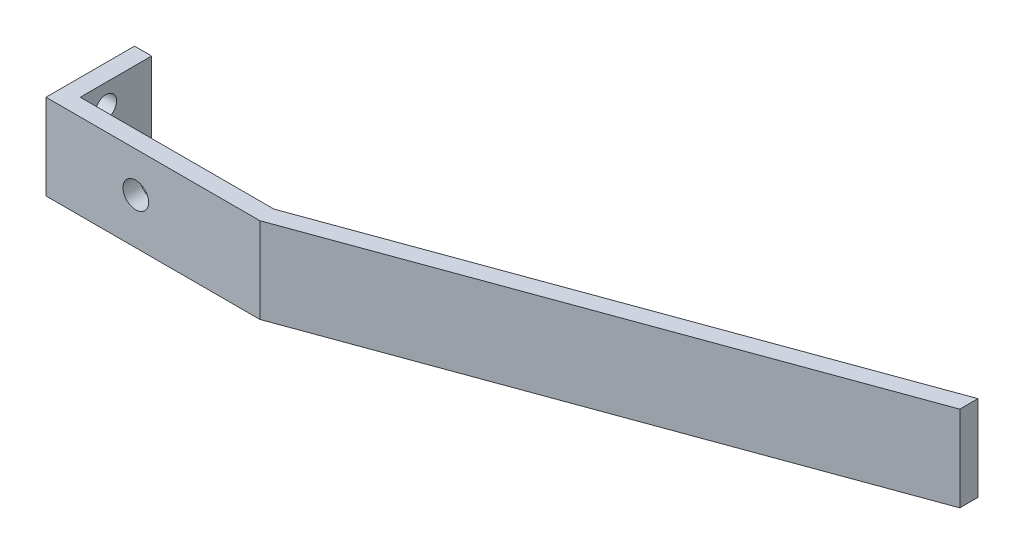
ISO-10303-21;
HEADER;
FILE_DESCRIPTION(('STEP AP214'),'2;1');
FILE_NAME('part.step','',(''),(''),'','','');
FILE_SCHEMA(('AUTOMOTIVE_DESIGN { 1 0 10303 214 1 1 1 1 }'));
ENDSEC;
DATA;
#1=APPLICATION_CONTEXT('core data for automotive mechanical design processes');
#2=APPLICATION_PROTOCOL_DEFINITION('international standard','automotive_design',2000,#1);
#3=PRODUCT_CONTEXT('',#1,'mechanical');
#4=PRODUCT('Part','Part','',(#3));
#5=PRODUCT_RELATED_PRODUCT_CATEGORY('part','',(#4));
#6=PRODUCT_DEFINITION_FORMATION('','',#4);
#7=PRODUCT_DEFINITION_CONTEXT('part definition',#1,'design');
#8=PRODUCT_DEFINITION('design','',#6,#7);
#9=PRODUCT_DEFINITION_SHAPE('','',#8);
#10=(LENGTH_UNIT() NAMED_UNIT(*) SI_UNIT(.MILLI.,.METRE.));
#11=(NAMED_UNIT(*) PLANE_ANGLE_UNIT() SI_UNIT($,.RADIAN.));
#12=(NAMED_UNIT(*) SI_UNIT($,.STERADIAN.) SOLID_ANGLE_UNIT());
#13=UNCERTAINTY_MEASURE_WITH_UNIT(LENGTH_MEASURE(1.E-05),#10,'distance_accuracy_value','');
#14=(GEOMETRIC_REPRESENTATION_CONTEXT(3) GLOBAL_UNCERTAINTY_ASSIGNED_CONTEXT((#13)) GLOBAL_UNIT_ASSIGNED_CONTEXT((#10,
#11,#12)) REPRESENTATION_CONTEXT('',''));
#15=CARTESIAN_POINT('',(0.,0.,0.));
#16=DIRECTION('',(0.,0.,1.));
#17=DIRECTION('',(1.,0.,0.));
#18=AXIS2_PLACEMENT_3D('',#15,#16,#17);
#19=CARTESIAN_POINT('',(0.,20.,0.));
#20=DIRECTION('',(0.,0.,-1.));
#21=DIRECTION('',(-1.,0.,0.));
#22=AXIS2_PLACEMENT_3D('',#19,#20,#21);
#23=PLANE('',#22);
#24=CARTESIAN_POINT('',(21.,10.6900904766501,0.));
#25=DIRECTION('',(0.,0.,1.));
#26=DIRECTION('',(1.,0.,0.));
#27=AXIS2_PLACEMENT_3D('',#24,#25,#26);
#28=CIRCLE('',#27,3.);
#29=CARTESIAN_POINT('',(24.,10.6900904766501,0.));
#30=VERTEX_POINT('',#29);
#31=EDGE_CURVE('E194',#30,#30,#28,.T.);
#32=ORIENTED_EDGE('',*,*,#31,.F.);
#33=EDGE_LOOP('',(#32));
#34=FACE_BOUND('',#33,.T.);
#35=DIRECTION('',(1.,0.,0.));
#36=VECTOR('',#35,1.);
#37=CARTESIAN_POINT('',(0.,0.,0.));
#38=LINE('',#37,#36);
#39=CARTESIAN_POINT('',(0.,0.,0.));
#40=VERTEX_POINT('',#39);
#41=CARTESIAN_POINT('',(50.,0.,0.));
#42=VERTEX_POINT('',#41);
#43=EDGE_CURVE('E135',#40,#42,#38,.T.);
#44=ORIENTED_EDGE('',*,*,#43,.T.);
#45=DIRECTION('',(0.,-1.,0.));
#46=VECTOR('',#45,1.);
#47=CARTESIAN_POINT('',(50.,20.,0.));
#48=LINE('',#47,#46);
#49=CARTESIAN_POINT('',(50.,20.,0.));
#50=VERTEX_POINT('',#49);
#51=EDGE_CURVE('E43',#50,#42,#48,.T.);
#52=ORIENTED_EDGE('',*,*,#51,.F.);
#53=DIRECTION('',(1.,0.,0.));
#54=VECTOR('',#53,1.);
#55=CARTESIAN_POINT('',(0.,20.,0.));
#56=LINE('',#55,#54);
#57=CARTESIAN_POINT('',(0.,20.,0.));
#58=VERTEX_POINT('',#57);
#59=EDGE_CURVE('E95',#58,#50,#56,.T.);
#60=ORIENTED_EDGE('',*,*,#59,.F.);
#61=DIRECTION('',(0.,-1.,0.));
#62=VECTOR('',#61,1.);
#63=CARTESIAN_POINT('',(0.,20.,0.));
#64=LINE('',#63,#62);
#65=EDGE_CURVE('E11',#58,#40,#64,.T.);
#66=ORIENTED_EDGE('',*,*,#65,.T.);
#67=EDGE_LOOP('',(#44,#52,#60,#66));
#68=FACE_BOUND('',#67,.T.);
#69=ADVANCED_FACE('F35',(#34,#68),#23,.F.);
#70=CARTESIAN_POINT('',(50.,20.,0.));
#71=DIRECTION('',(-0.342020143325669,0.,-0.939692620785908));
#72=DIRECTION('',(-0.939692620785908,0.,0.342020143325669));
#73=AXIS2_PLACEMENT_3D('',#70,#71,#72);
#74=PLANE('',#73);
#75=DIRECTION('',(0.939692620785908,0.,-0.342020143325669));
#76=VECTOR('',#75,1.);
#77=CARTESIAN_POINT('',(50.,0.,0.));
#78=LINE('',#77,#76);
#79=CARTESIAN_POINT('',(170.,0.,-43.6764281119444));
#80=VERTEX_POINT('',#79);
#81=EDGE_CURVE('E137',#42,#80,#78,.T.);
#82=ORIENTED_EDGE('',*,*,#81,.T.);
#83=DIRECTION('',(0.,-1.,0.));
#84=VECTOR('',#83,1.);
#85=CARTESIAN_POINT('',(170.,20.,-43.6764281119444));
#86=LINE('',#85,#84);
#87=CARTESIAN_POINT('',(170.,20.,-43.6764281119444));
#88=VERTEX_POINT('',#87);
#89=EDGE_CURVE('E155',#88,#80,#86,.T.);
#90=ORIENTED_EDGE('',*,*,#89,.F.);
#91=DIRECTION('',(0.939692620785908,0.,-0.342020143325669));
#92=VECTOR('',#91,1.);
#93=CARTESIAN_POINT('',(50.,20.,0.));
#94=LINE('',#93,#92);
#95=EDGE_CURVE('E163',#50,#88,#94,.T.);
#96=ORIENTED_EDGE('',*,*,#95,.F.);
#97=ORIENTED_EDGE('',*,*,#51,.T.);
#98=EDGE_LOOP('',(#82,#90,#96,#97));
#99=FACE_BOUND('',#98,.T.);
#100=ADVANCED_FACE('F161',(#99),#74,.F.);
#101=CARTESIAN_POINT('',(170.,20.,-47.933139201848));
#102=DIRECTION('',(-1.,0.,0.));
#103=DIRECTION('',(0.,0.,1.));
#104=AXIS2_PLACEMENT_3D('',#101,#102,#103);
#105=PLANE('',#104);
#106=DIRECTION('',(0.,0.,-1.));
#107=VECTOR('',#106,1.);
#108=CARTESIAN_POINT('',(170.,0.,-47.933139201848));
#109=LINE('',#108,#107);
#110=CARTESIAN_POINT('',(170.,0.,-47.933139201848));
#111=VERTEX_POINT('',#110);
#112=EDGE_CURVE('E140',#80,#111,#109,.T.);
#113=ORIENTED_EDGE('',*,*,#112,.T.);
#114=DIRECTION('',(0.,-1.,0.));
#115=VECTOR('',#114,1.);
#116=CARTESIAN_POINT('',(170.,20.,-47.933139201848));
#117=LINE('',#116,#115);
#118=CARTESIAN_POINT('',(170.,20.,-47.933139201848));
#119=VERTEX_POINT('',#118);
#120=EDGE_CURVE('E152',#119,#111,#117,.T.);
#121=ORIENTED_EDGE('',*,*,#120,.F.);
#122=DIRECTION('',(0.,0.,-1.));
#123=VECTOR('',#122,1.);
#124=CARTESIAN_POINT('',(170.,20.,-47.933139201848));
#125=LINE('',#124,#123);
#126=EDGE_CURVE('E176',#88,#119,#125,.T.);
#127=ORIENTED_EDGE('',*,*,#126,.F.);
#128=ORIENTED_EDGE('',*,*,#89,.T.);
#129=EDGE_LOOP('',(#113,#121,#127,#128));
#130=FACE_BOUND('',#129,.T.);
#131=ADVANCED_FACE('F172',(#130),#105,.F.);
#132=CARTESIAN_POINT('',(49.2946920771661,20.,-4.));
#133=DIRECTION('',(0.342020143325669,0.,0.939692620785908));
#134=DIRECTION('',(0.939692620785908,0.,-0.342020143325669));
#135=AXIS2_PLACEMENT_3D('',#132,#133,#134);
#136=PLANE('',#135);
#137=DIRECTION('',(-0.939692620785908,0.,0.342020143325669));
#138=VECTOR('',#137,1.);
#139=CARTESIAN_POINT('',(49.2946920771661,0.,-4.));
#140=LINE('',#139,#138);
#141=CARTESIAN_POINT('',(49.2946920771661,0.,-4.));
#142=VERTEX_POINT('',#141);
#143=EDGE_CURVE('E142',#111,#142,#140,.T.);
#144=ORIENTED_EDGE('',*,*,#143,.T.);
#145=DIRECTION('',(0.,-1.,0.));
#146=VECTOR('',#145,1.);
#147=CARTESIAN_POINT('',(49.2946920771661,20.,-4.));
#148=LINE('',#147,#146);
#149=CARTESIAN_POINT('',(49.2946920771661,20.,-4.));
#150=VERTEX_POINT('',#149);
#151=EDGE_CURVE('E124',#150,#142,#148,.T.);
#152=ORIENTED_EDGE('',*,*,#151,.F.);
#153=DIRECTION('',(-0.939692620785908,0.,0.342020143325669));
#154=VECTOR('',#153,1.);
#155=CARTESIAN_POINT('',(49.2946920771661,20.,-4.));
#156=LINE('',#155,#154);
#157=EDGE_CURVE('E115',#119,#150,#156,.T.);
#158=ORIENTED_EDGE('',*,*,#157,.F.);
#159=ORIENTED_EDGE('',*,*,#120,.T.);
#160=EDGE_LOOP('',(#144,#152,#158,#159));
#161=FACE_BOUND('',#160,.T.);
#162=ADVANCED_FACE('F175',(#161),#136,.F.);
#163=CARTESIAN_POINT('',(4.,20.,-4.));
#164=DIRECTION('',(0.,0.,1.));
#165=DIRECTION('',(1.,0.,0.));
#166=AXIS2_PLACEMENT_3D('',#163,#164,#165);
#167=PLANE('',#166);
#168=CARTESIAN_POINT('',(21.,10.6900904766501,-4.));
#169=DIRECTION('',(0.,0.,1.));
#170=DIRECTION('',(1.,0.,0.));
#171=AXIS2_PLACEMENT_3D('',#168,#169,#170);
#172=CIRCLE('',#171,3.);
#173=CARTESIAN_POINT('',(24.,10.6900904766501,-4.));
#174=VERTEX_POINT('',#173);
#175=EDGE_CURVE('E191',#174,#174,#172,.T.);
#176=ORIENTED_EDGE('',*,*,#175,.T.);
#177=EDGE_LOOP('',(#176));
#178=FACE_BOUND('',#177,.T.);
#179=DIRECTION('',(-1.,0.,0.));
#180=VECTOR('',#179,1.);
#181=CARTESIAN_POINT('',(4.,0.,-4.));
#182=LINE('',#181,#180);
#183=CARTESIAN_POINT('',(4.,0.,-4.));
#184=VERTEX_POINT('',#183);
#185=EDGE_CURVE('E123',#142,#184,#182,.T.);
#186=ORIENTED_EDGE('',*,*,#185,.T.);
#187=DIRECTION('',(0.,-1.,0.));
#188=VECTOR('',#187,1.);
#189=CARTESIAN_POINT('',(4.,20.,-4.));
#190=LINE('',#189,#188);
#191=CARTESIAN_POINT('',(4.,20.,-4.));
#192=VERTEX_POINT('',#191);
#193=EDGE_CURVE('E120',#192,#184,#190,.T.);
#194=ORIENTED_EDGE('',*,*,#193,.F.);
#195=DIRECTION('',(-1.,0.,0.));
#196=VECTOR('',#195,1.);
#197=CARTESIAN_POINT('',(4.,20.,-4.));
#198=LINE('',#197,#196);
#199=EDGE_CURVE('E109',#150,#192,#198,.T.);
#200=ORIENTED_EDGE('',*,*,#199,.F.);
#201=ORIENTED_EDGE('',*,*,#151,.T.);
#202=EDGE_LOOP('',(#186,#194,#200,#201));
#203=FACE_BOUND('',#202,.T.);
#204=ADVANCED_FACE('F121',(#178,#203),#167,.F.);
#205=CARTESIAN_POINT('',(4.,20.,-4.));
#206=DIRECTION('',(-1.,0.,0.));
#207=DIRECTION('',(0.,0.,1.));
#208=AXIS2_PLACEMENT_3D('',#205,#206,#207);
#209=PLANE('',#208);
#210=CARTESIAN_POINT('',(4.,15.,-10.));
#211=DIRECTION('',(-1.,0.,0.));
#212=DIRECTION('',(0.,0.,1.));
#213=AXIS2_PLACEMENT_3D('',#210,#211,#212);
#214=CIRCLE('',#213,2.5);
#215=CARTESIAN_POINT('',(4.,15.,-7.5));
#216=VERTEX_POINT('',#215);
#217=EDGE_CURVE('E185',#216,#216,#214,.T.);
#218=ORIENTED_EDGE('',*,*,#217,.T.);
#219=EDGE_LOOP('',(#218));
#220=FACE_BOUND('',#219,.T.);
#221=CARTESIAN_POINT('',(4.,5.,-10.));
#222=DIRECTION('',(-1.,0.,0.));
#223=DIRECTION('',(0.,0.,1.));
#224=AXIS2_PLACEMENT_3D('',#221,#222,#223);
#225=CIRCLE('',#224,2.5);
#226=CARTESIAN_POINT('',(4.,5.,-7.5));
#227=VERTEX_POINT('',#226);
#228=EDGE_CURVE('E138',#227,#227,#225,.T.);
#229=ORIENTED_EDGE('',*,*,#228,.T.);
#230=EDGE_LOOP('',(#229));
#231=FACE_BOUND('',#230,.T.);
#232=DIRECTION('',(0.,0.,-1.));
#233=VECTOR('',#232,1.);
#234=CARTESIAN_POINT('',(4.,0.,-4.));
#235=LINE('',#234,#233);
#236=CARTESIAN_POINT('',(4.,0.,-20.7));
#237=VERTEX_POINT('',#236);
#238=EDGE_CURVE('E81',#184,#237,#235,.T.);
#239=ORIENTED_EDGE('',*,*,#238,.T.);
#240=DIRECTION('',(0.,-1.,0.));
#241=VECTOR('',#240,1.);
#242=CARTESIAN_POINT('',(4.,20.,-20.7));
#243=LINE('',#242,#241);
#244=CARTESIAN_POINT('',(4.,20.,-20.7));
#245=VERTEX_POINT('',#244);
#246=EDGE_CURVE('E125',#245,#237,#243,.T.);
#247=ORIENTED_EDGE('',*,*,#246,.F.);
#248=DIRECTION('',(0.,0.,-1.));
#249=VECTOR('',#248,1.);
#250=CARTESIAN_POINT('',(4.,20.,-4.));
#251=LINE('',#250,#249);
#252=EDGE_CURVE('E113',#192,#245,#251,.T.);
#253=ORIENTED_EDGE('',*,*,#252,.F.);
#254=ORIENTED_EDGE('',*,*,#193,.T.);
#255=EDGE_LOOP('',(#239,#247,#253,#254));
#256=FACE_BOUND('',#255,.T.);
#257=ADVANCED_FACE('F127',(#220,#231,#256),#209,.F.);
#258=CARTESIAN_POINT('',(4.,20.,-20.7));
#259=DIRECTION('',(0.,0.,1.));
#260=DIRECTION('',(1.,0.,0.));
#261=AXIS2_PLACEMENT_3D('',#258,#259,#260);
#262=PLANE('',#261);
#263=DIRECTION('',(-1.,0.,0.));
#264=VECTOR('',#263,1.);
#265=CARTESIAN_POINT('',(4.,0.,-20.7));
#266=LINE('',#265,#264);
#267=CARTESIAN_POINT('',(0.,0.,-20.7));
#268=VERTEX_POINT('',#267);
#269=EDGE_CURVE('E88',#237,#268,#266,.T.);
#270=ORIENTED_EDGE('',*,*,#269,.T.);
#271=DIRECTION('',(0.,-1.,0.));
#272=VECTOR('',#271,1.);
#273=CARTESIAN_POINT('',(0.,20.,-20.7));
#274=LINE('',#273,#272);
#275=CARTESIAN_POINT('',(0.,20.,-20.7));
#276=VERTEX_POINT('',#275);
#277=EDGE_CURVE('E131',#276,#268,#274,.T.);
#278=ORIENTED_EDGE('',*,*,#277,.F.);
#279=DIRECTION('',(-1.,0.,0.));
#280=VECTOR('',#279,1.);
#281=CARTESIAN_POINT('',(4.,20.,-20.7));
#282=LINE('',#281,#280);
#283=EDGE_CURVE('E129',#245,#276,#282,.T.);
#284=ORIENTED_EDGE('',*,*,#283,.F.);
#285=ORIENTED_EDGE('',*,*,#246,.T.);
#286=EDGE_LOOP('',(#270,#278,#284,#285));
#287=FACE_BOUND('',#286,.T.);
#288=ADVANCED_FACE('F210',(#287),#262,.F.);
#289=CARTESIAN_POINT('',(0.,20.,-4.));
#290=DIRECTION('',(1.,0.,0.));
#291=DIRECTION('',(0.,0.,-1.));
#292=AXIS2_PLACEMENT_3D('',#289,#290,#291);
#293=PLANE('',#292);
#294=CARTESIAN_POINT('',(0.,15.,-10.));
#295=DIRECTION('',(-1.,0.,0.));
#296=DIRECTION('',(0.,0.,1.));
#297=AXIS2_PLACEMENT_3D('',#294,#295,#296);
#298=CIRCLE('',#297,2.5);
#299=CARTESIAN_POINT('',(0.,15.,-7.5));
#300=VERTEX_POINT('',#299);
#301=EDGE_CURVE('E188',#300,#300,#298,.T.);
#302=ORIENTED_EDGE('',*,*,#301,.F.);
#303=EDGE_LOOP('',(#302));
#304=FACE_BOUND('',#303,.T.);
#305=CARTESIAN_POINT('',(0.,5.,-10.));
#306=DIRECTION('',(-1.,0.,0.));
#307=DIRECTION('',(0.,0.,1.));
#308=AXIS2_PLACEMENT_3D('',#305,#306,#307);
#309=CIRCLE('',#308,2.5);
#310=CARTESIAN_POINT('',(0.,5.,-7.5));
#311=VERTEX_POINT('',#310);
#312=EDGE_CURVE('E182',#311,#311,#309,.T.);
#313=ORIENTED_EDGE('',*,*,#312,.F.);
#314=EDGE_LOOP('',(#313));
#315=FACE_BOUND('',#314,.T.);
#316=DIRECTION('',(0.,0.,1.));
#317=VECTOR('',#316,1.);
#318=CARTESIAN_POINT('',(0.,0.,-4.));
#319=LINE('',#318,#317);
#320=EDGE_CURVE('E147',#268,#40,#319,.T.);
#321=ORIENTED_EDGE('',*,*,#320,.T.);
#322=ORIENTED_EDGE('',*,*,#65,.F.);
#323=DIRECTION('',(0.,0.,1.));
#324=VECTOR('',#323,1.);
#325=CARTESIAN_POINT('',(0.,20.,0.));
#326=LINE('',#325,#324);
#327=EDGE_CURVE('E51',#276,#58,#326,.T.);
#328=ORIENTED_EDGE('',*,*,#327,.F.);
#329=ORIENTED_EDGE('',*,*,#277,.T.);
#330=EDGE_LOOP('',(#321,#322,#328,#329));
#331=FACE_BOUND('',#330,.T.);
#332=ADVANCED_FACE('F209',(#304,#315,#331),#293,.F.);
#333=CARTESIAN_POINT('',(0.,20.,0.));
#334=DIRECTION('',(0.,1.,0.));
#335=DIRECTION('',(0.,0.,1.));
#336=AXIS2_PLACEMENT_3D('',#333,#334,#335);
#337=PLANE('',#336);
#338=ORIENTED_EDGE('',*,*,#327,.T.);
#339=ORIENTED_EDGE('',*,*,#59,.T.);
#340=ORIENTED_EDGE('',*,*,#95,.T.);
#341=ORIENTED_EDGE('',*,*,#126,.T.);
#342=ORIENTED_EDGE('',*,*,#157,.T.);
#343=ORIENTED_EDGE('',*,*,#199,.T.);
#344=ORIENTED_EDGE('',*,*,#252,.T.);
#345=ORIENTED_EDGE('',*,*,#283,.T.);
#346=EDGE_LOOP('',(#338,#339,#340,#341,#342,#343,#344,#345));
#347=FACE_BOUND('',#346,.T.);
#348=ADVANCED_FACE('F111',(#347),#337,.T.);
#349=CARTESIAN_POINT('',(0.,0.,0.));
#350=DIRECTION('',(0.,1.,0.));
#351=DIRECTION('',(0.,0.,1.));
#352=AXIS2_PLACEMENT_3D('',#349,#350,#351);
#353=PLANE('',#352);
#354=ORIENTED_EDGE('',*,*,#43,.F.);
#355=ORIENTED_EDGE('',*,*,#320,.F.);
#356=ORIENTED_EDGE('',*,*,#269,.F.);
#357=ORIENTED_EDGE('',*,*,#238,.F.);
#358=ORIENTED_EDGE('',*,*,#185,.F.);
#359=ORIENTED_EDGE('',*,*,#143,.F.);
#360=ORIENTED_EDGE('',*,*,#112,.F.);
#361=ORIENTED_EDGE('',*,*,#81,.F.);
#362=EDGE_LOOP('',(#354,#355,#356,#357,#358,#359,#360,#361));
#363=FACE_BOUND('',#362,.T.);
#364=ADVANCED_FACE('F167',(#363),#353,.F.);
#365=CARTESIAN_POINT('',(4.,5.,-10.));
#366=DIRECTION('',(-1.,0.,0.));
#367=DIRECTION('',(0.,0.,1.));
#368=AXIS2_PLACEMENT_3D('',#365,#366,#367);
#369=CYLINDRICAL_SURFACE('',#368,2.5);
#370=ORIENTED_EDGE('',*,*,#228,.F.);
#371=EDGE_LOOP('',(#370));
#372=FACE_BOUND('',#371,.T.);
#373=ORIENTED_EDGE('',*,*,#312,.T.);
#374=EDGE_LOOP('',(#373));
#375=FACE_BOUND('',#374,.T.);
#376=ADVANCED_FACE('F273',(#372,#375),#369,.F.);
#377=CARTESIAN_POINT('',(4.,15.,-10.));
#378=DIRECTION('',(-1.,0.,0.));
#379=DIRECTION('',(0.,0.,1.));
#380=AXIS2_PLACEMENT_3D('',#377,#378,#379);
#381=CYLINDRICAL_SURFACE('',#380,2.5);
#382=ORIENTED_EDGE('',*,*,#217,.F.);
#383=EDGE_LOOP('',(#382));
#384=FACE_BOUND('',#383,.T.);
#385=ORIENTED_EDGE('',*,*,#301,.T.);
#386=EDGE_LOOP('',(#385));
#387=FACE_BOUND('',#386,.T.);
#388=ADVANCED_FACE('F204',(#384,#387),#381,.F.);
#389=CARTESIAN_POINT('',(21.,10.6900904766501,-4.));
#390=DIRECTION('',(0.,0.,1.));
#391=DIRECTION('',(1.,0.,0.));
#392=AXIS2_PLACEMENT_3D('',#389,#390,#391);
#393=CYLINDRICAL_SURFACE('',#392,3.);
#394=ORIENTED_EDGE('',*,*,#175,.F.);
#395=EDGE_LOOP('',(#394));
#396=FACE_BOUND('',#395,.T.);
#397=ORIENTED_EDGE('',*,*,#31,.T.);
#398=EDGE_LOOP('',(#397));
#399=FACE_BOUND('',#398,.T.);
#400=ADVANCED_FACE('F201',(#396,#399),#393,.F.);
#401=CLOSED_SHELL('',(#69,#100,#131,#162,#204,#257,#288,#332,#348,#364,#376,#388,#400));
#402=MANIFOLD_SOLID_BREP('B2',#401);
#403=ADVANCED_BREP_SHAPE_REPRESENTATION('',(#18,#402),#14);
#404=SHAPE_DEFINITION_REPRESENTATION(#9,#403);
ENDSEC;
END-ISO-10303-21;
